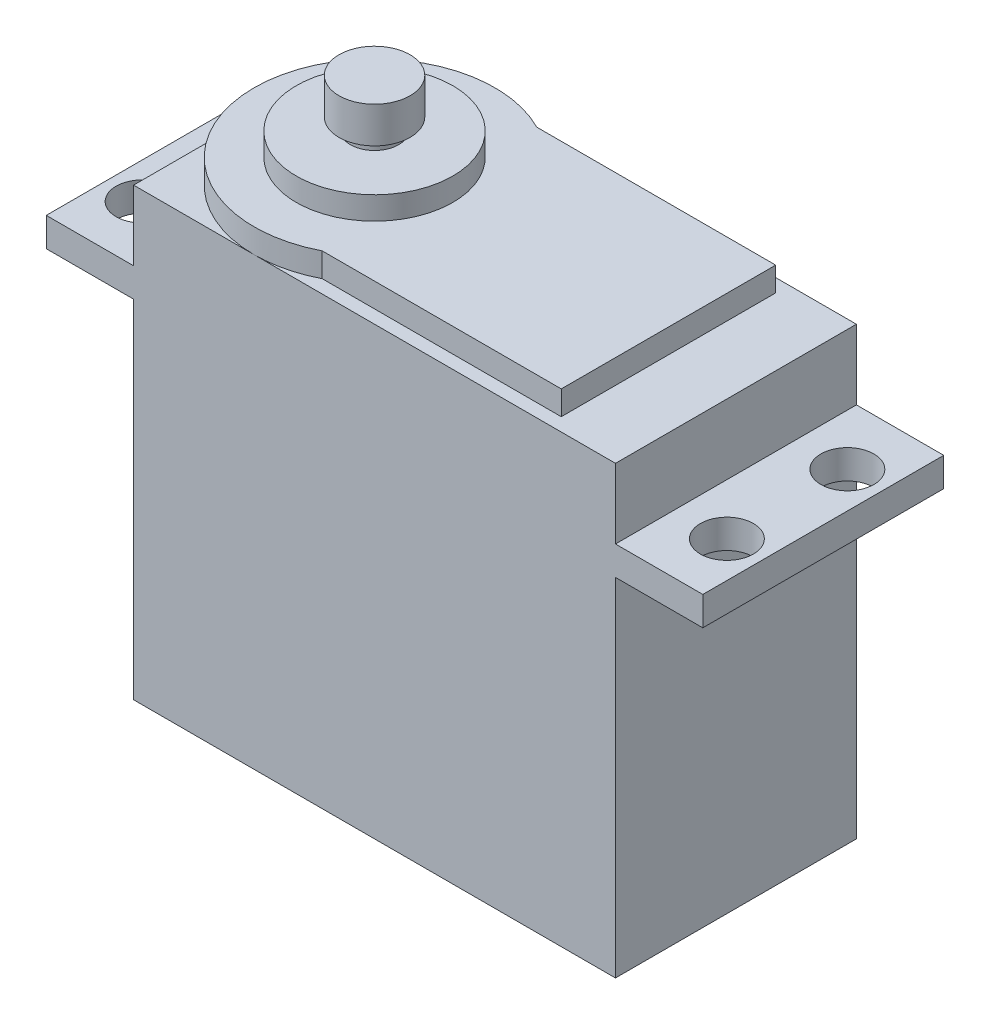
ISO-10303-21;
HEADER;
FILE_DESCRIPTION(('STEP AP214'),'2;1');
FILE_NAME('part.step','',(''),(''),'','','');
FILE_SCHEMA(('AUTOMOTIVE_DESIGN { 1 0 10303 214 1 1 1 1 }'));
ENDSEC;
DATA;
#1=APPLICATION_CONTEXT('core data for automotive mechanical design processes');
#2=APPLICATION_PROTOCOL_DEFINITION('international standard','automotive_design',2000,#1);
#3=PRODUCT_CONTEXT('',#1,'mechanical');
#4=PRODUCT('Part','Part','',(#3));
#5=PRODUCT_RELATED_PRODUCT_CATEGORY('part','',(#4));
#6=PRODUCT_DEFINITION_FORMATION('','',#4);
#7=PRODUCT_DEFINITION_CONTEXT('part definition',#1,'design');
#8=PRODUCT_DEFINITION('design','',#6,#7);
#9=PRODUCT_DEFINITION_SHAPE('','',#8);
#10=(LENGTH_UNIT() NAMED_UNIT(*) SI_UNIT(.MILLI.,.METRE.));
#11=(NAMED_UNIT(*) PLANE_ANGLE_UNIT() SI_UNIT($,.RADIAN.));
#12=(NAMED_UNIT(*) SI_UNIT($,.STERADIAN.) SOLID_ANGLE_UNIT());
#13=UNCERTAINTY_MEASURE_WITH_UNIT(LENGTH_MEASURE(1.E-05),#10,'distance_accuracy_value','');
#14=(GEOMETRIC_REPRESENTATION_CONTEXT(3) GLOBAL_UNCERTAINTY_ASSIGNED_CONTEXT((#13)) GLOBAL_UNIT_ASSIGNED_CONTEXT((#10,
#11,#12)) REPRESENTATION_CONTEXT('',''));
#15=CARTESIAN_POINT('',(0.,0.,0.));
#16=DIRECTION('',(0.,0.,1.));
#17=DIRECTION('',(1.,0.,0.));
#18=AXIS2_PLACEMENT_3D('',#15,#16,#17);
#19=CARTESIAN_POINT('',(-10.,44.9,0.));
#20=DIRECTION('',(0.,-1.,0.));
#21=DIRECTION('',(0.,0.,-1.));
#22=AXIS2_PLACEMENT_3D('',#19,#20,#21);
#23=CYLINDRICAL_SURFACE('',#22,2.);
#24=CARTESIAN_POINT('',(-10.,40.9,0.));
#25=DIRECTION('',(0.,1.,0.));
#26=DIRECTION('',(0.,0.,1.));
#27=AXIS2_PLACEMENT_3D('',#24,#25,#26);
#28=CIRCLE('',#27,2.);
#29=CARTESIAN_POINT('',(-10.,40.9,2.));
#30=VERTEX_POINT('',#29);
#31=EDGE_CURVE('E47',#30,#30,#28,.T.);
#32=ORIENTED_EDGE('',*,*,#31,.T.);
#33=EDGE_LOOP('',(#32));
#34=FACE_BOUND('',#33,.T.);
#35=CARTESIAN_POINT('',(-10.,41.9,0.));
#36=DIRECTION('',(0.,1.,0.));
#37=DIRECTION('',(0.,0.,1.));
#38=AXIS2_PLACEMENT_3D('',#35,#36,#37);
#39=CIRCLE('',#38,2.);
#40=CARTESIAN_POINT('',(-10.,41.9,2.));
#41=VERTEX_POINT('',#40);
#42=EDGE_CURVE('E11',#41,#41,#39,.T.);
#43=ORIENTED_EDGE('',*,*,#42,.F.);
#44=EDGE_LOOP('',(#43));
#45=FACE_BOUND('',#44,.T.);
#46=ADVANCED_FACE('F41',(#34,#45),#23,.T.);
#47=CARTESIAN_POINT('',(0.,37.,0.));
#48=DIRECTION('',(0.,1.,0.));
#49=DIRECTION('',(0.,0.,1.));
#50=AXIS2_PLACEMENT_3D('',#47,#48,#49);
#51=PLANE('',#50);
#52=CARTESIAN_POINT('',(-10.,37.,0.));
#53=DIRECTION('',(0.,1.,0.));
#54=DIRECTION('',(0.,0.,1.));
#55=AXIS2_PLACEMENT_3D('',#52,#53,#54);
#56=CIRCLE('',#55,10.);
#57=CARTESIAN_POINT('',(-5.4403947539288,37.,-8.9));
#58=VERTEX_POINT('',#57);
#59=CARTESIAN_POINT('',(-10.,37.,-10.));
#60=VERTEX_POINT('',#59);
#61=EDGE_CURVE('E57',#58,#60,#56,.T.);
#62=ORIENTED_EDGE('',*,*,#61,.F.);
#63=DIRECTION('',(-1.,0.,0.));
#64=VECTOR('',#63,1.);
#65=CARTESIAN_POINT('',(-5.4403947539288,37.,-8.9));
#66=LINE('',#65,#64);
#67=CARTESIAN_POINT('',(14.4,37.,-8.9));
#68=VERTEX_POINT('',#67);
#69=EDGE_CURVE('E58',#68,#58,#66,.T.);
#70=ORIENTED_EDGE('',*,*,#69,.F.);
#71=DIRECTION('',(0.,0.,-1.));
#72=VECTOR('',#71,1.);
#73=CARTESIAN_POINT('',(14.4,37.,-8.9));
#74=LINE('',#73,#72);
#75=CARTESIAN_POINT('',(14.4,37.,8.9));
#76=VERTEX_POINT('',#75);
#77=EDGE_CURVE('E439',#76,#68,#74,.T.);
#78=ORIENTED_EDGE('',*,*,#77,.F.);
#79=DIRECTION('',(1.,0.,0.));
#80=VECTOR('',#79,1.);
#81=CARTESIAN_POINT('',(14.4,37.,8.9));
#82=LINE('',#81,#80);
#83=CARTESIAN_POINT('',(-5.4403947539288,37.,8.9));
#84=VERTEX_POINT('',#83);
#85=EDGE_CURVE('E436',#84,#76,#82,.T.);
#86=ORIENTED_EDGE('',*,*,#85,.F.);
#87=CARTESIAN_POINT('',(-10.,37.,10.));
#88=VERTEX_POINT('',#87);
#89=EDGE_CURVE('E187',#88,#84,#56,.T.);
#90=ORIENTED_EDGE('',*,*,#89,.F.);
#91=DIRECTION('',(1.,0.,0.));
#92=VECTOR('',#91,1.);
#93=CARTESIAN_POINT('',(-20.,37.,10.));
#94=LINE('',#93,#92);
#95=CARTESIAN_POINT('',(20.,37.,10.));
#96=VERTEX_POINT('',#95);
#97=EDGE_CURVE('E274',#88,#96,#94,.T.);
#98=ORIENTED_EDGE('',*,*,#97,.T.);
#99=DIRECTION('',(0.,0.,-1.));
#100=VECTOR('',#99,1.);
#101=CARTESIAN_POINT('',(20.,37.,-10.));
#102=LINE('',#101,#100);
#103=CARTESIAN_POINT('',(20.,37.,-10.));
#104=VERTEX_POINT('',#103);
#105=EDGE_CURVE('E263',#96,#104,#102,.T.);
#106=ORIENTED_EDGE('',*,*,#105,.T.);
#107=DIRECTION('',(-1.,0.,0.));
#108=VECTOR('',#107,1.);
#109=CARTESIAN_POINT('',(-20.,37.,-10.));
#110=LINE('',#109,#108);
#111=EDGE_CURVE('E270',#104,#60,#110,.T.);
#112=ORIENTED_EDGE('',*,*,#111,.T.);
#113=EDGE_LOOP('',(#62,#70,#78,#86,#90,#98,#106,#112));
#114=FACE_BOUND('',#113,.T.);
#115=ADVANCED_FACE('F357',(#114),#51,.T.);
#116=CARTESIAN_POINT('',(-20.,37.,0.));
#117=VERTEX_POINT('',#116);
#118=EDGE_CURVE('E435',#60,#117,#56,.T.);
#119=ORIENTED_EDGE('',*,*,#118,.F.);
#120=CARTESIAN_POINT('',(-20.,37.,-10.));
#121=VERTEX_POINT('',#120);
#122=EDGE_CURVE('E267',#60,#121,#110,.T.);
#123=ORIENTED_EDGE('',*,*,#122,.T.);
#124=DIRECTION('',(0.,0.,1.));
#125=VECTOR('',#124,1.);
#126=CARTESIAN_POINT('',(-20.,37.,-10.));
#127=LINE('',#126,#125);
#128=EDGE_CURVE('E272',#121,#117,#127,.T.);
#129=ORIENTED_EDGE('',*,*,#128,.T.);
#130=EDGE_LOOP('',(#119,#123,#129));
#131=FACE_BOUND('',#130,.T.);
#132=ADVANCED_FACE('F362',(#131),#51,.T.);
#133=CARTESIAN_POINT('',(20.,37.,-10.));
#134=DIRECTION('',(-1.,0.,0.));
#135=DIRECTION('',(0.,0.,1.));
#136=AXIS2_PLACEMENT_3D('',#133,#134,#135);
#137=PLANE('',#136);
#138=DIRECTION('',(0.,0.,-1.));
#139=VECTOR('',#138,1.);
#140=CARTESIAN_POINT('',(20.,28.8,-10.));
#141=LINE('',#140,#139);
#142=CARTESIAN_POINT('',(20.,28.8,10.));
#143=VERTEX_POINT('',#142);
#144=CARTESIAN_POINT('',(20.,28.8,-10.));
#145=VERTEX_POINT('',#144);
#146=EDGE_CURVE('E259',#143,#145,#141,.T.);
#147=ORIENTED_EDGE('',*,*,#146,.F.);
#148=DIRECTION('',(0.,-1.,0.));
#149=VECTOR('',#148,1.);
#150=CARTESIAN_POINT('',(20.,37.,10.));
#151=LINE('',#150,#149);
#152=CARTESIAN_POINT('',(20.,0.,10.));
#153=VERTEX_POINT('',#152);
#154=EDGE_CURVE('E277',#143,#153,#151,.T.);
#155=ORIENTED_EDGE('',*,*,#154,.T.);
#156=DIRECTION('',(0.,0.,-1.));
#157=VECTOR('',#156,1.);
#158=CARTESIAN_POINT('',(20.,0.,-10.));
#159=LINE('',#158,#157);
#160=CARTESIAN_POINT('',(20.,0.,-10.));
#161=VERTEX_POINT('',#160);
#162=EDGE_CURVE('E265',#153,#161,#159,.T.);
#163=ORIENTED_EDGE('',*,*,#162,.T.);
#164=DIRECTION('',(0.,-1.,0.));
#165=VECTOR('',#164,1.);
#166=CARTESIAN_POINT('',(20.,37.,-10.));
#167=LINE('',#166,#165);
#168=EDGE_CURVE('E299',#145,#161,#167,.T.);
#169=ORIENTED_EDGE('',*,*,#168,.F.);
#170=EDGE_LOOP('',(#147,#155,#163,#169));
#171=FACE_BOUND('',#170,.T.);
#172=ADVANCED_FACE('F316',(#171),#137,.F.);
#173=CARTESIAN_POINT('',(-20.,37.,-10.));
#174=DIRECTION('',(1.,0.,0.));
#175=DIRECTION('',(0.,0.,-1.));
#176=AXIS2_PLACEMENT_3D('',#173,#174,#175);
#177=PLANE('',#176);
#178=DIRECTION('',(0.,0.,1.));
#179=VECTOR('',#178,1.);
#180=CARTESIAN_POINT('',(-20.,28.8,-10.));
#181=LINE('',#180,#179);
#182=CARTESIAN_POINT('',(-20.,28.8,-10.));
#183=VERTEX_POINT('',#182);
#184=CARTESIAN_POINT('',(-20.,28.8,10.));
#185=VERTEX_POINT('',#184);
#186=EDGE_CURVE('E257',#183,#185,#181,.T.);
#187=ORIENTED_EDGE('',*,*,#186,.F.);
#188=DIRECTION('',(0.,-1.,0.));
#189=VECTOR('',#188,1.);
#190=CARTESIAN_POINT('',(-20.,37.,-10.));
#191=LINE('',#190,#189);
#192=CARTESIAN_POINT('',(-20.,0.,-10.));
#193=VERTEX_POINT('',#192);
#194=EDGE_CURVE('E298',#183,#193,#191,.T.);
#195=ORIENTED_EDGE('',*,*,#194,.T.);
#196=DIRECTION('',(0.,0.,1.));
#197=VECTOR('',#196,1.);
#198=CARTESIAN_POINT('',(-20.,0.,-10.));
#199=LINE('',#198,#197);
#200=CARTESIAN_POINT('',(-20.,0.,10.));
#201=VERTEX_POINT('',#200);
#202=EDGE_CURVE('E282',#193,#201,#199,.T.);
#203=ORIENTED_EDGE('',*,*,#202,.T.);
#204=DIRECTION('',(0.,-1.,0.));
#205=VECTOR('',#204,1.);
#206=CARTESIAN_POINT('',(-20.,37.,10.));
#207=LINE('',#206,#205);
#208=EDGE_CURVE('E292',#185,#201,#207,.T.);
#209=ORIENTED_EDGE('',*,*,#208,.F.);
#210=EDGE_LOOP('',(#187,#195,#203,#209));
#211=FACE_BOUND('',#210,.T.);
#212=ADVANCED_FACE('F330',(#211),#177,.F.);
#213=CARTESIAN_POINT('',(20.,31.2,10.));
#214=VERTEX_POINT('',#213);
#215=EDGE_CURVE('E286',#96,#214,#151,.T.);
#216=ORIENTED_EDGE('',*,*,#215,.T.);
#217=DIRECTION('',(0.,0.,-1.));
#218=VECTOR('',#217,1.);
#219=CARTESIAN_POINT('',(20.,31.2,-10.));
#220=LINE('',#219,#218);
#221=CARTESIAN_POINT('',(20.,31.2,-10.));
#222=VERTEX_POINT('',#221);
#223=EDGE_CURVE('E253',#214,#222,#220,.T.);
#224=ORIENTED_EDGE('',*,*,#223,.T.);
#225=EDGE_CURVE('E297',#104,#222,#167,.T.);
#226=ORIENTED_EDGE('',*,*,#225,.F.);
#227=ORIENTED_EDGE('',*,*,#105,.F.);
#228=EDGE_LOOP('',(#216,#224,#226,#227));
#229=FACE_BOUND('',#228,.T.);
#230=ADVANCED_FACE('F43',(#229),#137,.F.);
#231=CARTESIAN_POINT('',(-20.,37.,-10.));
#232=DIRECTION('',(0.,0.,1.));
#233=DIRECTION('',(1.,0.,0.));
#234=AXIS2_PLACEMENT_3D('',#231,#232,#233);
#235=PLANE('',#234);
#236=ORIENTED_EDGE('',*,*,#225,.T.);
#237=DIRECTION('',(-1.,0.,0.));
#238=VECTOR('',#237,1.);
#239=CARTESIAN_POINT('',(-27.25,31.2,-10.));
#240=LINE('',#239,#238);
#241=CARTESIAN_POINT('',(27.25,31.2,-10.));
#242=VERTEX_POINT('',#241);
#243=EDGE_CURVE('E222',#242,#222,#240,.T.);
#244=ORIENTED_EDGE('',*,*,#243,.F.);
#245=DIRECTION('',(0.,1.,0.));
#246=VECTOR('',#245,1.);
#247=CARTESIAN_POINT('',(27.25,28.8,-10.));
#248=LINE('',#247,#246);
#249=CARTESIAN_POINT('',(27.25,28.8,-10.));
#250=VERTEX_POINT('',#249);
#251=EDGE_CURVE('E250',#250,#242,#248,.T.);
#252=ORIENTED_EDGE('',*,*,#251,.F.);
#253=DIRECTION('',(-1.,0.,0.));
#254=VECTOR('',#253,1.);
#255=CARTESIAN_POINT('',(-27.25,28.8,-10.));
#256=LINE('',#255,#254);
#257=EDGE_CURVE('E230',#250,#145,#256,.T.);
#258=ORIENTED_EDGE('',*,*,#257,.T.);
#259=ORIENTED_EDGE('',*,*,#168,.T.);
#260=DIRECTION('',(-1.,0.,0.));
#261=VECTOR('',#260,1.);
#262=CARTESIAN_POINT('',(-20.,0.,-10.));
#263=LINE('',#262,#261);
#264=EDGE_CURVE('E281',#161,#193,#263,.T.);
#265=ORIENTED_EDGE('',*,*,#264,.T.);
#266=ORIENTED_EDGE('',*,*,#194,.F.);
#267=CARTESIAN_POINT('',(-27.25,28.8,-10.));
#268=VERTEX_POINT('',#267);
#269=EDGE_CURVE('E226',#183,#268,#256,.T.);
#270=ORIENTED_EDGE('',*,*,#269,.T.);
#271=DIRECTION('',(0.,1.,0.));
#272=VECTOR('',#271,1.);
#273=CARTESIAN_POINT('',(-27.25,28.8,-10.));
#274=LINE('',#273,#272);
#275=CARTESIAN_POINT('',(-27.25,31.2,-10.));
#276=VERTEX_POINT('',#275);
#277=EDGE_CURVE('E243',#268,#276,#274,.T.);
#278=ORIENTED_EDGE('',*,*,#277,.T.);
#279=CARTESIAN_POINT('',(-20.,31.2,-10.));
#280=VERTEX_POINT('',#279);
#281=EDGE_CURVE('E241',#280,#276,#240,.T.);
#282=ORIENTED_EDGE('',*,*,#281,.F.);
#283=EDGE_CURVE('E300',#121,#280,#191,.T.);
#284=ORIENTED_EDGE('',*,*,#283,.F.);
#285=ORIENTED_EDGE('',*,*,#122,.F.);
#286=ORIENTED_EDGE('',*,*,#111,.F.);
#287=EDGE_LOOP('',(#236,#244,#252,#258,#259,#265,#266,#270,#278,#282,#284,#285,#286));
#288=FACE_BOUND('',#287,.T.);
#289=ADVANCED_FACE('F307',(#288),#235,.F.);
#290=ORIENTED_EDGE('',*,*,#283,.T.);
#291=DIRECTION('',(0.,0.,1.));
#292=VECTOR('',#291,1.);
#293=CARTESIAN_POINT('',(-20.,31.2,-10.));
#294=LINE('',#293,#292);
#295=CARTESIAN_POINT('',(-20.,31.2,10.));
#296=VERTEX_POINT('',#295);
#297=EDGE_CURVE('E246',#280,#296,#294,.T.);
#298=ORIENTED_EDGE('',*,*,#297,.T.);
#299=CARTESIAN_POINT('',(-20.,37.,10.));
#300=VERTEX_POINT('',#299);
#301=EDGE_CURVE('E291',#300,#296,#207,.T.);
#302=ORIENTED_EDGE('',*,*,#301,.F.);
#303=EDGE_CURVE('E268',#117,#300,#127,.T.);
#304=ORIENTED_EDGE('',*,*,#303,.F.);
#305=ORIENTED_EDGE('',*,*,#128,.F.);
#306=EDGE_LOOP('',(#290,#298,#302,#304,#305));
#307=FACE_BOUND('',#306,.T.);
#308=ADVANCED_FACE('F611',(#307),#177,.F.);
#309=CARTESIAN_POINT('',(-20.,37.,10.));
#310=DIRECTION('',(0.,0.,-1.));
#311=DIRECTION('',(-1.,0.,0.));
#312=AXIS2_PLACEMENT_3D('',#309,#310,#311);
#313=PLANE('',#312);
#314=ORIENTED_EDGE('',*,*,#301,.T.);
#315=DIRECTION('',(1.,0.,0.));
#316=VECTOR('',#315,1.);
#317=CARTESIAN_POINT('',(-27.25,31.2,10.));
#318=LINE('',#317,#316);
#319=CARTESIAN_POINT('',(-27.25,31.2,10.));
#320=VERTEX_POINT('',#319);
#321=EDGE_CURVE('E236',#320,#296,#318,.T.);
#322=ORIENTED_EDGE('',*,*,#321,.F.);
#323=DIRECTION('',(0.,1.,0.));
#324=VECTOR('',#323,1.);
#325=CARTESIAN_POINT('',(-27.25,28.8,10.));
#326=LINE('',#325,#324);
#327=CARTESIAN_POINT('',(-27.25,28.8,10.));
#328=VERTEX_POINT('',#327);
#329=EDGE_CURVE('E235',#328,#320,#326,.T.);
#330=ORIENTED_EDGE('',*,*,#329,.F.);
#331=DIRECTION('',(1.,0.,0.));
#332=VECTOR('',#331,1.);
#333=CARTESIAN_POINT('',(-27.25,28.8,10.));
#334=LINE('',#333,#332);
#335=EDGE_CURVE('E224',#328,#185,#334,.T.);
#336=ORIENTED_EDGE('',*,*,#335,.T.);
#337=ORIENTED_EDGE('',*,*,#208,.T.);
#338=DIRECTION('',(1.,0.,0.));
#339=VECTOR('',#338,1.);
#340=CARTESIAN_POINT('',(-20.,0.,10.));
#341=LINE('',#340,#339);
#342=EDGE_CURVE('E269',#201,#153,#341,.T.);
#343=ORIENTED_EDGE('',*,*,#342,.T.);
#344=ORIENTED_EDGE('',*,*,#154,.F.);
#345=CARTESIAN_POINT('',(27.25,28.8,10.));
#346=VERTEX_POINT('',#345);
#347=EDGE_CURVE('E219',#143,#346,#334,.T.);
#348=ORIENTED_EDGE('',*,*,#347,.T.);
#349=DIRECTION('',(0.,1.,0.));
#350=VECTOR('',#349,1.);
#351=CARTESIAN_POINT('',(27.25,28.8,10.));
#352=LINE('',#351,#350);
#353=CARTESIAN_POINT('',(27.25,31.2,10.));
#354=VERTEX_POINT('',#353);
#355=EDGE_CURVE('E248',#346,#354,#352,.T.);
#356=ORIENTED_EDGE('',*,*,#355,.T.);
#357=EDGE_CURVE('E232',#214,#354,#318,.T.);
#358=ORIENTED_EDGE('',*,*,#357,.F.);
#359=ORIENTED_EDGE('',*,*,#215,.F.);
#360=ORIENTED_EDGE('',*,*,#97,.F.);
#361=EDGE_CURVE('E273',#300,#88,#94,.T.);
#362=ORIENTED_EDGE('',*,*,#361,.F.);
#363=EDGE_LOOP('',(#314,#322,#330,#336,#337,#343,#344,#348,#356,#358,#359,#360,#362));
#364=FACE_BOUND('',#363,.T.);
#365=ADVANCED_FACE('F325',(#364),#313,.F.);
#366=EDGE_CURVE('E304',#117,#88,#56,.T.);
#367=ORIENTED_EDGE('',*,*,#366,.F.);
#368=ORIENTED_EDGE('',*,*,#303,.T.);
#369=ORIENTED_EDGE('',*,*,#361,.T.);
#370=EDGE_LOOP('',(#367,#368,#369));
#371=FACE_BOUND('',#370,.T.);
#372=ADVANCED_FACE('F370',(#371),#51,.T.);
#373=CARTESIAN_POINT('',(0.,0.,0.));
#374=DIRECTION('',(0.,1.,0.));
#375=DIRECTION('',(0.,0.,1.));
#376=AXIS2_PLACEMENT_3D('',#373,#374,#375);
#377=PLANE('',#376);
#378=ORIENTED_EDGE('',*,*,#162,.F.);
#379=ORIENTED_EDGE('',*,*,#342,.F.);
#380=ORIENTED_EDGE('',*,*,#202,.F.);
#381=ORIENTED_EDGE('',*,*,#264,.F.);
#382=EDGE_LOOP('',(#378,#379,#380,#381));
#383=FACE_BOUND('',#382,.T.);
#384=ADVANCED_FACE('F320',(#383),#377,.F.);
#385=CARTESIAN_POINT('',(-27.25,28.8,-10.));
#386=DIRECTION('',(-1.,0.,0.));
#387=DIRECTION('',(0.,0.,1.));
#388=AXIS2_PLACEMENT_3D('',#385,#386,#387);
#389=PLANE('',#388);
#390=DIRECTION('',(0.,0.,1.));
#391=VECTOR('',#390,1.);
#392=CARTESIAN_POINT('',(-27.25,31.2,-10.));
#393=LINE('',#392,#391);
#394=EDGE_CURVE('E213',#276,#320,#393,.T.);
#395=ORIENTED_EDGE('',*,*,#394,.F.);
#396=ORIENTED_EDGE('',*,*,#277,.F.);
#397=DIRECTION('',(0.,0.,1.));
#398=VECTOR('',#397,1.);
#399=CARTESIAN_POINT('',(-27.25,28.8,-10.));
#400=LINE('',#399,#398);
#401=EDGE_CURVE('E220',#268,#328,#400,.T.);
#402=ORIENTED_EDGE('',*,*,#401,.T.);
#403=ORIENTED_EDGE('',*,*,#329,.T.);
#404=EDGE_LOOP('',(#395,#396,#402,#403));
#405=FACE_BOUND('',#404,.T.);
#406=ADVANCED_FACE('F331',(#405),#389,.T.);
#407=CARTESIAN_POINT('',(-24.25,28.8,5.));
#408=DIRECTION('',(0.,1.,0.));
#409=DIRECTION('',(0.,0.,1.));
#410=AXIS2_PLACEMENT_3D('',#407,#408,#409);
#411=CYLINDRICAL_SURFACE('',#410,2.2);
#412=CARTESIAN_POINT('',(-24.25,28.8,5.));
#413=DIRECTION('',(0.,1.,0.));
#414=DIRECTION('',(0.,0.,1.));
#415=AXIS2_PLACEMENT_3D('',#412,#413,#414);
#416=CIRCLE('',#415,2.2);
#417=CARTESIAN_POINT('',(-24.25,28.8,7.2));
#418=VERTEX_POINT('',#417);
#419=EDGE_CURVE('E188',#418,#418,#416,.T.);
#420=ORIENTED_EDGE('',*,*,#419,.F.);
#421=EDGE_LOOP('',(#420));
#422=FACE_BOUND('',#421,.T.);
#423=CARTESIAN_POINT('',(-24.25,31.2,5.));
#424=DIRECTION('',(0.,1.,0.));
#425=DIRECTION('',(0.,0.,1.));
#426=AXIS2_PLACEMENT_3D('',#423,#424,#425);
#427=CIRCLE('',#426,2.2);
#428=CARTESIAN_POINT('',(-24.25,31.2,7.2));
#429=VERTEX_POINT('',#428);
#430=EDGE_CURVE('E190',#429,#429,#427,.T.);
#431=ORIENTED_EDGE('',*,*,#430,.T.);
#432=EDGE_LOOP('',(#431));
#433=FACE_BOUND('',#432,.T.);
#434=ADVANCED_FACE('F347',(#422,#433),#411,.F.);
#435=CARTESIAN_POINT('',(-24.25,28.8,-5.));
#436=DIRECTION('',(0.,1.,0.));
#437=DIRECTION('',(0.,0.,1.));
#438=AXIS2_PLACEMENT_3D('',#435,#436,#437);
#439=CYLINDRICAL_SURFACE('',#438,2.2);
#440=CARTESIAN_POINT('',(-24.25,28.8,-5.));
#441=DIRECTION('',(0.,1.,0.));
#442=DIRECTION('',(0.,0.,1.));
#443=AXIS2_PLACEMENT_3D('',#440,#441,#442);
#444=CIRCLE('',#443,2.2);
#445=CARTESIAN_POINT('',(-24.25,28.8,-2.8));
#446=VERTEX_POINT('',#445);
#447=EDGE_CURVE('E197',#446,#446,#444,.T.);
#448=ORIENTED_EDGE('',*,*,#447,.F.);
#449=EDGE_LOOP('',(#448));
#450=FACE_BOUND('',#449,.T.);
#451=CARTESIAN_POINT('',(-24.25,31.2,-5.));
#452=DIRECTION('',(0.,1.,0.));
#453=DIRECTION('',(0.,0.,1.));
#454=AXIS2_PLACEMENT_3D('',#451,#452,#453);
#455=CIRCLE('',#454,2.2);
#456=CARTESIAN_POINT('',(-24.25,31.2,-2.8));
#457=VERTEX_POINT('',#456);
#458=EDGE_CURVE('E200',#457,#457,#455,.T.);
#459=ORIENTED_EDGE('',*,*,#458,.T.);
#460=EDGE_LOOP('',(#459));
#461=FACE_BOUND('',#460,.T.);
#462=ADVANCED_FACE('F336',(#450,#461),#439,.F.);
#463=CARTESIAN_POINT('',(0.,28.8,0.));
#464=DIRECTION('',(0.,1.,0.));
#465=DIRECTION('',(0.,0.,1.));
#466=AXIS2_PLACEMENT_3D('',#463,#464,#465);
#467=PLANE('',#466);
#468=ORIENTED_EDGE('',*,*,#447,.T.);
#469=EDGE_LOOP('',(#468));
#470=FACE_BOUND('',#469,.T.);
#471=ORIENTED_EDGE('',*,*,#419,.T.);
#472=EDGE_LOOP('',(#471));
#473=FACE_BOUND('',#472,.T.);
#474=ORIENTED_EDGE('',*,*,#269,.F.);
#475=ORIENTED_EDGE('',*,*,#186,.T.);
#476=ORIENTED_EDGE('',*,*,#335,.F.);
#477=ORIENTED_EDGE('',*,*,#401,.F.);
#478=EDGE_LOOP('',(#474,#475,#476,#477));
#479=FACE_BOUND('',#478,.T.);
#480=ADVANCED_FACE('F333',(#470,#473,#479),#467,.F.);
#481=CARTESIAN_POINT('',(0.,31.2,0.));
#482=DIRECTION('',(0.,1.,0.));
#483=DIRECTION('',(0.,0.,1.));
#484=AXIS2_PLACEMENT_3D('',#481,#482,#483);
#485=PLANE('',#484);
#486=ORIENTED_EDGE('',*,*,#458,.F.);
#487=EDGE_LOOP('',(#486));
#488=FACE_BOUND('',#487,.T.);
#489=ORIENTED_EDGE('',*,*,#430,.F.);
#490=EDGE_LOOP('',(#489));
#491=FACE_BOUND('',#490,.T.);
#492=ORIENTED_EDGE('',*,*,#297,.F.);
#493=ORIENTED_EDGE('',*,*,#281,.T.);
#494=ORIENTED_EDGE('',*,*,#394,.T.);
#495=ORIENTED_EDGE('',*,*,#321,.T.);
#496=EDGE_LOOP('',(#492,#493,#494,#495));
#497=FACE_BOUND('',#496,.T.);
#498=ADVANCED_FACE('F340',(#488,#491,#497),#485,.T.);
#499=CARTESIAN_POINT('',(24.25,28.8,5.));
#500=DIRECTION('',(0.,1.,0.));
#501=DIRECTION('',(0.,0.,1.));
#502=AXIS2_PLACEMENT_3D('',#499,#500,#501);
#503=CIRCLE('',#502,2.2);
#504=CARTESIAN_POINT('',(24.25,28.8,7.2));
#505=VERTEX_POINT('',#504);
#506=EDGE_CURVE('E203',#505,#505,#503,.T.);
#507=ORIENTED_EDGE('',*,*,#506,.T.);
#508=EDGE_LOOP('',(#507));
#509=FACE_BOUND('',#508,.T.);
#510=CARTESIAN_POINT('',(24.25,28.8,-5.));
#511=DIRECTION('',(0.,1.,0.));
#512=DIRECTION('',(0.,0.,1.));
#513=AXIS2_PLACEMENT_3D('',#510,#511,#512);
#514=CIRCLE('',#513,2.2);
#515=CARTESIAN_POINT('',(24.25,28.8,-2.8));
#516=VERTEX_POINT('',#515);
#517=EDGE_CURVE('E211',#516,#516,#514,.T.);
#518=ORIENTED_EDGE('',*,*,#517,.T.);
#519=EDGE_LOOP('',(#518));
#520=FACE_BOUND('',#519,.T.);
#521=ORIENTED_EDGE('',*,*,#347,.F.);
#522=ORIENTED_EDGE('',*,*,#146,.T.);
#523=ORIENTED_EDGE('',*,*,#257,.F.);
#524=DIRECTION('',(0.,0.,-1.));
#525=VECTOR('',#524,1.);
#526=CARTESIAN_POINT('',(27.25,28.8,-10.));
#527=LINE('',#526,#525);
#528=EDGE_CURVE('E223',#346,#250,#527,.T.);
#529=ORIENTED_EDGE('',*,*,#528,.F.);
#530=EDGE_LOOP('',(#521,#522,#523,#529));
#531=FACE_BOUND('',#530,.T.);
#532=ADVANCED_FACE('F341',(#509,#520,#531),#467,.F.);
#533=CARTESIAN_POINT('',(24.25,31.2,-5.));
#534=DIRECTION('',(0.,1.,0.));
#535=DIRECTION('',(0.,0.,1.));
#536=AXIS2_PLACEMENT_3D('',#533,#534,#535);
#537=CIRCLE('',#536,2.2);
#538=CARTESIAN_POINT('',(24.25,31.2,-2.8));
#539=VERTEX_POINT('',#538);
#540=EDGE_CURVE('E206',#539,#539,#537,.T.);
#541=ORIENTED_EDGE('',*,*,#540,.F.);
#542=EDGE_LOOP('',(#541));
#543=FACE_BOUND('',#542,.T.);
#544=CARTESIAN_POINT('',(24.25,31.2,5.));
#545=DIRECTION('',(0.,1.,0.));
#546=DIRECTION('',(0.,0.,1.));
#547=AXIS2_PLACEMENT_3D('',#544,#545,#546);
#548=CIRCLE('',#547,2.2);
#549=CARTESIAN_POINT('',(24.25,31.2,7.2));
#550=VERTEX_POINT('',#549);
#551=EDGE_CURVE('E204',#550,#550,#548,.T.);
#552=ORIENTED_EDGE('',*,*,#551,.F.);
#553=EDGE_LOOP('',(#552));
#554=FACE_BOUND('',#553,.T.);
#555=ORIENTED_EDGE('',*,*,#223,.F.);
#556=ORIENTED_EDGE('',*,*,#357,.T.);
#557=DIRECTION('',(0.,0.,-1.));
#558=VECTOR('',#557,1.);
#559=CARTESIAN_POINT('',(27.25,31.2,-10.));
#560=LINE('',#559,#558);
#561=EDGE_CURVE('E238',#354,#242,#560,.T.);
#562=ORIENTED_EDGE('',*,*,#561,.T.);
#563=ORIENTED_EDGE('',*,*,#243,.T.);
#564=EDGE_LOOP('',(#555,#556,#562,#563));
#565=FACE_BOUND('',#564,.T.);
#566=ADVANCED_FACE('F348',(#543,#554,#565),#485,.T.);
#567=CARTESIAN_POINT('',(27.25,28.8,-10.));
#568=DIRECTION('',(1.,0.,0.));
#569=DIRECTION('',(0.,0.,-1.));
#570=AXIS2_PLACEMENT_3D('',#567,#568,#569);
#571=PLANE('',#570);
#572=ORIENTED_EDGE('',*,*,#561,.F.);
#573=ORIENTED_EDGE('',*,*,#355,.F.);
#574=ORIENTED_EDGE('',*,*,#528,.T.);
#575=ORIENTED_EDGE('',*,*,#251,.T.);
#576=EDGE_LOOP('',(#572,#573,#574,#575));
#577=FACE_BOUND('',#576,.T.);
#578=ADVANCED_FACE('F403',(#577),#571,.T.);
#579=CARTESIAN_POINT('',(24.25,28.8,-5.));
#580=DIRECTION('',(0.,1.,0.));
#581=DIRECTION('',(0.,0.,1.));
#582=AXIS2_PLACEMENT_3D('',#579,#580,#581);
#583=CYLINDRICAL_SURFACE('',#582,2.2);
#584=ORIENTED_EDGE('',*,*,#517,.F.);
#585=EDGE_LOOP('',(#584));
#586=FACE_BOUND('',#585,.T.);
#587=ORIENTED_EDGE('',*,*,#540,.T.);
#588=EDGE_LOOP('',(#587));
#589=FACE_BOUND('',#588,.T.);
#590=ADVANCED_FACE('F405',(#586,#589),#583,.F.);
#591=CARTESIAN_POINT('',(24.25,28.8,5.));
#592=DIRECTION('',(0.,1.,0.));
#593=DIRECTION('',(0.,0.,1.));
#594=AXIS2_PLACEMENT_3D('',#591,#592,#593);
#595=CYLINDRICAL_SURFACE('',#594,2.2);
#596=ORIENTED_EDGE('',*,*,#506,.F.);
#597=EDGE_LOOP('',(#596));
#598=FACE_BOUND('',#597,.T.);
#599=ORIENTED_EDGE('',*,*,#551,.T.);
#600=EDGE_LOOP('',(#599));
#601=FACE_BOUND('',#600,.T.);
#602=ADVANCED_FACE('F399',(#598,#601),#595,.F.);
#603=CARTESIAN_POINT('',(-10.,39.,0.));
#604=DIRECTION('',(0.,-1.,0.));
#605=DIRECTION('',(0.,0.,-1.));
#606=AXIS2_PLACEMENT_3D('',#603,#604,#605);
#607=CYLINDRICAL_SURFACE('',#606,10.);
#608=ORIENTED_EDGE('',*,*,#61,.T.);
#609=ORIENTED_EDGE('',*,*,#118,.T.);
#610=ORIENTED_EDGE('',*,*,#366,.T.);
#611=ORIENTED_EDGE('',*,*,#89,.T.);
#612=DIRECTION('',(0.,-1.,0.));
#613=VECTOR('',#612,1.);
#614=CARTESIAN_POINT('',(-5.4403947539288,39.,8.9));
#615=LINE('',#614,#613);
#616=CARTESIAN_POINT('',(-5.4403947539288,39.,8.9));
#617=VERTEX_POINT('',#616);
#618=EDGE_CURVE('E170',#617,#84,#615,.T.);
#619=ORIENTED_EDGE('',*,*,#618,.F.);
#620=CARTESIAN_POINT('',(-10.,39.,0.));
#621=DIRECTION('',(0.,1.,0.));
#622=DIRECTION('',(0.,0.,1.));
#623=AXIS2_PLACEMENT_3D('',#620,#621,#622);
#624=CIRCLE('',#623,10.);
#625=CARTESIAN_POINT('',(-5.4403947539288,39.,-8.9));
#626=VERTEX_POINT('',#625);
#627=EDGE_CURVE('E173',#626,#617,#624,.T.);
#628=ORIENTED_EDGE('',*,*,#627,.F.);
#629=DIRECTION('',(0.,-1.,0.));
#630=VECTOR('',#629,1.);
#631=CARTESIAN_POINT('',(-5.4403947539288,39.,-8.9));
#632=LINE('',#631,#630);
#633=EDGE_CURVE('E442',#626,#58,#632,.T.);
#634=ORIENTED_EDGE('',*,*,#633,.T.);
#635=EDGE_LOOP('',(#608,#609,#610,#611,#619,#628,#634));
#636=FACE_BOUND('',#635,.T.);
#637=ADVANCED_FACE('F183',(#636),#607,.T.);
#638=CARTESIAN_POINT('',(14.4,39.,8.9));
#639=DIRECTION('',(0.,0.,-1.));
#640=DIRECTION('',(-1.,0.,0.));
#641=AXIS2_PLACEMENT_3D('',#638,#639,#640);
#642=PLANE('',#641);
#643=ORIENTED_EDGE('',*,*,#85,.T.);
#644=DIRECTION('',(0.,-1.,0.));
#645=VECTOR('',#644,1.);
#646=CARTESIAN_POINT('',(14.4,39.,8.9));
#647=LINE('',#646,#645);
#648=CARTESIAN_POINT('',(14.4,39.,8.9));
#649=VERTEX_POINT('',#648);
#650=EDGE_CURVE('E169',#649,#76,#647,.T.);
#651=ORIENTED_EDGE('',*,*,#650,.F.);
#652=DIRECTION('',(1.,0.,0.));
#653=VECTOR('',#652,1.);
#654=CARTESIAN_POINT('',(14.4,39.,8.9));
#655=LINE('',#654,#653);
#656=EDGE_CURVE('E162',#617,#649,#655,.T.);
#657=ORIENTED_EDGE('',*,*,#656,.F.);
#658=ORIENTED_EDGE('',*,*,#618,.T.);
#659=EDGE_LOOP('',(#643,#651,#657,#658));
#660=FACE_BOUND('',#659,.T.);
#661=ADVANCED_FACE('F164',(#660),#642,.F.);
#662=CARTESIAN_POINT('',(14.4,39.,-8.9));
#663=DIRECTION('',(-1.,0.,0.));
#664=DIRECTION('',(0.,0.,1.));
#665=AXIS2_PLACEMENT_3D('',#662,#663,#664);
#666=PLANE('',#665);
#667=ORIENTED_EDGE('',*,*,#77,.T.);
#668=DIRECTION('',(0.,-1.,0.));
#669=VECTOR('',#668,1.);
#670=CARTESIAN_POINT('',(14.4,39.,-8.9));
#671=LINE('',#670,#669);
#672=CARTESIAN_POINT('',(14.4,39.,-8.9));
#673=VERTEX_POINT('',#672);
#674=EDGE_CURVE('E195',#673,#68,#671,.T.);
#675=ORIENTED_EDGE('',*,*,#674,.F.);
#676=DIRECTION('',(0.,0.,-1.));
#677=VECTOR('',#676,1.);
#678=CARTESIAN_POINT('',(14.4,39.,-8.9));
#679=LINE('',#678,#677);
#680=EDGE_CURVE('E175',#649,#673,#679,.T.);
#681=ORIENTED_EDGE('',*,*,#680,.F.);
#682=ORIENTED_EDGE('',*,*,#650,.T.);
#683=EDGE_LOOP('',(#667,#675,#681,#682));
#684=FACE_BOUND('',#683,.T.);
#685=ADVANCED_FACE('F387',(#684),#666,.F.);
#686=CARTESIAN_POINT('',(-5.4403947539288,39.,-8.9));
#687=DIRECTION('',(0.,0.,1.));
#688=DIRECTION('',(1.,0.,0.));
#689=AXIS2_PLACEMENT_3D('',#686,#687,#688);
#690=PLANE('',#689);
#691=ORIENTED_EDGE('',*,*,#69,.T.);
#692=ORIENTED_EDGE('',*,*,#633,.F.);
#693=DIRECTION('',(-1.,0.,0.));
#694=VECTOR('',#693,1.);
#695=CARTESIAN_POINT('',(-5.4403947539288,39.,-8.9));
#696=LINE('',#695,#694);
#697=EDGE_CURVE('E178',#673,#626,#696,.T.);
#698=ORIENTED_EDGE('',*,*,#697,.F.);
#699=ORIENTED_EDGE('',*,*,#674,.T.);
#700=EDGE_LOOP('',(#691,#692,#698,#699));
#701=FACE_BOUND('',#700,.T.);
#702=ADVANCED_FACE('F381',(#701),#690,.F.);
#703=CARTESIAN_POINT('',(-10.,39.,0.));
#704=DIRECTION('',(0.,1.,0.));
#705=DIRECTION('',(0.,0.,1.));
#706=AXIS2_PLACEMENT_3D('',#703,#704,#705);
#707=PLANE('',#706);
#708=CARTESIAN_POINT('',(-10.,39.,0.));
#709=DIRECTION('',(0.,1.,0.));
#710=DIRECTION('',(0.,0.,1.));
#711=AXIS2_PLACEMENT_3D('',#708,#709,#710);
#712=CIRCLE('',#711,6.5);
#713=CARTESIAN_POINT('',(-10.,39.,-6.5));
#714=VERTEX_POINT('',#713);
#715=EDGE_CURVE('E433',#714,#714,#712,.T.);
#716=ORIENTED_EDGE('',*,*,#715,.F.);
#717=EDGE_LOOP('',(#716));
#718=FACE_BOUND('',#717,.T.);
#719=ORIENTED_EDGE('',*,*,#627,.T.);
#720=ORIENTED_EDGE('',*,*,#656,.T.);
#721=ORIENTED_EDGE('',*,*,#680,.T.);
#722=ORIENTED_EDGE('',*,*,#697,.T.);
#723=EDGE_LOOP('',(#719,#720,#721,#722));
#724=FACE_BOUND('',#723,.T.);
#725=ADVANCED_FACE('F176',(#718,#724),#707,.T.);
#726=CARTESIAN_POINT('',(-10.,40.9,0.));
#727=DIRECTION('',(0.,-1.,0.));
#728=DIRECTION('',(0.,0.,-1.));
#729=AXIS2_PLACEMENT_3D('',#726,#727,#728);
#730=CYLINDRICAL_SURFACE('',#729,6.5);
#731=CARTESIAN_POINT('',(-10.,40.9,0.));
#732=DIRECTION('',(0.,1.,0.));
#733=DIRECTION('',(0.,0.,1.));
#734=AXIS2_PLACEMENT_3D('',#731,#732,#733);
#735=CIRCLE('',#734,6.5);
#736=CARTESIAN_POINT('',(-10.,40.9,-6.5));
#737=VERTEX_POINT('',#736);
#738=EDGE_CURVE('E440',#737,#737,#735,.T.);
#739=CARTESIAN_POINT('',(-10.,40.9,-6.5));
#740=CARTESIAN_POINT('',(-10.,40.8802083333333,-6.5));
#741=CARTESIAN_POINT('',(-10.,40.8604166666667,-6.5));
#742=CARTESIAN_POINT('',(-10.,40.8208333333333,-6.5));
#743=CARTESIAN_POINT('',(-10.,40.8010416666667,-6.5));
#744=CARTESIAN_POINT('',(-10.,40.7614583333333,-6.5));
#745=CARTESIAN_POINT('',(-10.,40.7416666666667,-6.5));
#746=CARTESIAN_POINT('',(-10.,40.7020833333333,-6.5));
#747=CARTESIAN_POINT('',(-10.,40.6822916666667,-6.5));
#748=CARTESIAN_POINT('',(-10.,40.6427083333333,-6.5));
#749=CARTESIAN_POINT('',(-10.,40.6229166666667,-6.5));
#750=CARTESIAN_POINT('',(-10.,40.5833333333333,-6.5));
#751=CARTESIAN_POINT('',(-10.,40.5635416666667,-6.5));
#752=CARTESIAN_POINT('',(-10.,40.5239583333333,-6.5));
#753=CARTESIAN_POINT('',(-10.,40.5041666666667,-6.5));
#754=CARTESIAN_POINT('',(-10.,40.4645833333333,-6.5));
#755=CARTESIAN_POINT('',(-10.,40.4447916666667,-6.5));
#756=CARTESIAN_POINT('',(-10.,40.4052083333333,-6.5));
#757=CARTESIAN_POINT('',(-10.,40.3854166666667,-6.5));
#758=CARTESIAN_POINT('',(-10.,40.3458333333333,-6.5));
#759=CARTESIAN_POINT('',(-10.,40.3260416666667,-6.5));
#760=CARTESIAN_POINT('',(-10.,40.2864583333333,-6.5));
#761=CARTESIAN_POINT('',(-10.,40.2666666666667,-6.5));
#762=CARTESIAN_POINT('',(-10.,40.2270833333333,-6.5));
#763=CARTESIAN_POINT('',(-10.,40.2072916666667,-6.5));
#764=CARTESIAN_POINT('',(-10.,40.1677083333333,-6.5));
#765=CARTESIAN_POINT('',(-10.,40.1479166666667,-6.5));
#766=CARTESIAN_POINT('',(-10.,40.1083333333333,-6.5));
#767=CARTESIAN_POINT('',(-10.,40.0885416666667,-6.5));
#768=CARTESIAN_POINT('',(-10.,40.0489583333333,-6.5));
#769=CARTESIAN_POINT('',(-10.,40.0291666666667,-6.5));
#770=CARTESIAN_POINT('',(-10.,39.9895833333333,-6.5));
#771=CARTESIAN_POINT('',(-10.,39.9697916666667,-6.5));
#772=CARTESIAN_POINT('',(-10.,39.9302083333333,-6.5));
#773=CARTESIAN_POINT('',(-10.,39.9104166666667,-6.5));
#774=CARTESIAN_POINT('',(-10.,39.8708333333333,-6.5));
#775=CARTESIAN_POINT('',(-10.,39.8510416666667,-6.5));
#776=CARTESIAN_POINT('',(-10.,39.8114583333333,-6.5));
#777=CARTESIAN_POINT('',(-10.,39.7916666666667,-6.5));
#778=CARTESIAN_POINT('',(-10.,39.7520833333333,-6.5));
#779=CARTESIAN_POINT('',(-10.,39.7322916666667,-6.5));
#780=CARTESIAN_POINT('',(-10.,39.6927083333333,-6.5));
#781=CARTESIAN_POINT('',(-10.,39.6729166666667,-6.5));
#782=CARTESIAN_POINT('',(-10.,39.6333333333333,-6.5));
#783=CARTESIAN_POINT('',(-10.,39.6135416666667,-6.5));
#784=CARTESIAN_POINT('',(-10.,39.5739583333333,-6.5));
#785=CARTESIAN_POINT('',(-10.,39.5541666666667,-6.5));
#786=CARTESIAN_POINT('',(-10.,39.5145833333333,-6.5));
#787=CARTESIAN_POINT('',(-10.,39.4947916666667,-6.5));
#788=CARTESIAN_POINT('',(-10.,39.4552083333333,-6.5));
#789=CARTESIAN_POINT('',(-10.,39.4354166666667,-6.5));
#790=CARTESIAN_POINT('',(-10.,39.3958333333333,-6.5));
#791=CARTESIAN_POINT('',(-10.,39.3760416666667,-6.5));
#792=CARTESIAN_POINT('',(-10.,39.3364583333333,-6.5));
#793=CARTESIAN_POINT('',(-10.,39.3166666666667,-6.5));
#794=CARTESIAN_POINT('',(-10.,39.2770833333333,-6.5));
#795=CARTESIAN_POINT('',(-10.,39.2572916666667,-6.5));
#796=CARTESIAN_POINT('',(-10.,39.2177083333333,-6.5));
#797=CARTESIAN_POINT('',(-10.,39.1979166666667,-6.5));
#798=CARTESIAN_POINT('',(-10.,39.1583333333333,-6.5));
#799=CARTESIAN_POINT('',(-10.,39.1385416666667,-6.5));
#800=CARTESIAN_POINT('',(-10.,39.0989583333333,-6.5));
#801=CARTESIAN_POINT('',(-10.,39.0791666666667,-6.5));
#802=CARTESIAN_POINT('',(-10.,39.0395833333333,-6.5));
#803=CARTESIAN_POINT('',(-10.,39.0197916666667,-6.5));
#804=CARTESIAN_POINT('',(-10.,39.,-6.5));
#805=B_SPLINE_CURVE_WITH_KNOTS('',3,(#739,#740,#741,#742,#743,#744,#745,#746,#747,#748,#749,
#750,#751,#752,#753,#754,#755,#756,#757,#758,#759,#760,#761,#762,#763,#764,#765,#766,#767,#768,
#769,#770,#771,#772,#773,#774,#775,#776,#777,#778,#779,#780,#781,#782,#783,#784,#785,#786,#787,
#788,#789,#790,#791,#792,#793,#794,#795,#796,#797,#798,#799,#800,#801,#802,#803,#804),
.UNSPECIFIED.,.F.,.F.,(4,2,2,2,2,2,2,2,2,2,2,2,2,2,2,2,2,2,2,2,2,2,2,2,2,2,2,2,2,2,2,2,4),(0.,
0.0593750000000004,0.118750000000001,0.178125000000001,0.237500000000002,0.296875000000002,
0.356250000000002,0.415625000000003,0.475000000000003,0.534375000000004,0.593750000000004,
0.653125000000004,0.712500000000005,0.771875000000005,0.831250000000006,0.890625000000006,0.95,
1.009375,1.06875,1.128125,1.1875,1.246875,1.30625,1.365625,1.425,1.484375,1.54375,1.603125,
1.6625,1.721875,1.78125000000001,1.84062500000001,1.9),.UNSPECIFIED.);
#806=EDGE_CURVE('BSEAM380',#737,#714,#805,.T.);
#807=ORIENTED_EDGE('',*,*,#738,.F.);
#808=ORIENTED_EDGE('',*,*,#715,.T.);
#809=ORIENTED_EDGE('',*,*,#806,.T.);
#810=ORIENTED_EDGE('',*,*,#806,.F.);
#811=EDGE_LOOP('',(#807,#809,#808,#810));
#812=FACE_BOUND('',#811,.T.);
#813=ADVANCED_FACE('F380',(#812),#730,.T.);
#814=CARTESIAN_POINT('',(-10.,40.9,0.));
#815=DIRECTION('',(0.,1.,0.));
#816=DIRECTION('',(0.,0.,1.));
#817=AXIS2_PLACEMENT_3D('',#814,#815,#816);
#818=PLANE('',#817);
#819=ORIENTED_EDGE('',*,*,#31,.F.);
#820=EDGE_LOOP('',(#819));
#821=FACE_BOUND('',#820,.T.);
#822=ORIENTED_EDGE('',*,*,#738,.T.);
#823=EDGE_LOOP('',(#822));
#824=FACE_BOUND('',#823,.T.);
#825=ADVANCED_FACE('F372',(#821,#824),#818,.T.);
#826=CARTESIAN_POINT('',(-10.,41.9,0.));
#827=DIRECTION('',(0.,1.,0.));
#828=DIRECTION('',(0.,0.,1.));
#829=AXIS2_PLACEMENT_3D('',#826,#827,#828);
#830=CYLINDRICAL_SURFACE('',#829,2.95);
#831=CARTESIAN_POINT('',(-10.,41.9,0.));
#832=DIRECTION('',(0.,1.,0.));
#833=DIRECTION('',(0.,0.,1.));
#834=AXIS2_PLACEMENT_3D('',#831,#832,#833);
#835=CIRCLE('',#834,2.95);
#836=CARTESIAN_POINT('',(-10.,41.9,2.95));
#837=VERTEX_POINT('',#836);
#838=EDGE_CURVE('E451',#837,#837,#835,.T.);
#839=ORIENTED_EDGE('',*,*,#838,.T.);
#840=EDGE_LOOP('',(#839));
#841=FACE_BOUND('',#840,.T.);
#842=CARTESIAN_POINT('',(-10.,44.9,0.));
#843=DIRECTION('',(0.,1.,0.));
#844=DIRECTION('',(0.,0.,1.));
#845=AXIS2_PLACEMENT_3D('',#842,#843,#844);
#846=CIRCLE('',#845,2.95);
#847=CARTESIAN_POINT('',(-10.,44.9,2.95));
#848=VERTEX_POINT('',#847);
#849=EDGE_CURVE('E452',#848,#848,#846,.T.);
#850=ORIENTED_EDGE('',*,*,#849,.F.);
#851=EDGE_LOOP('',(#850));
#852=FACE_BOUND('',#851,.T.);
#853=ADVANCED_FACE('F376',(#841,#852),#830,.T.);
#854=CARTESIAN_POINT('',(-10.,41.9,0.));
#855=DIRECTION('',(0.,1.,0.));
#856=DIRECTION('',(0.,0.,1.));
#857=AXIS2_PLACEMENT_3D('',#854,#855,#856);
#858=PLANE('',#857);
#859=ORIENTED_EDGE('',*,*,#42,.T.);
#860=EDGE_LOOP('',(#859));
#861=FACE_BOUND('',#860,.T.);
#862=ORIENTED_EDGE('',*,*,#838,.F.);
#863=EDGE_LOOP('',(#862));
#864=FACE_BOUND('',#863,.T.);
#865=ADVANCED_FACE('F462',(#861,#864),#858,.F.);
#866=CARTESIAN_POINT('',(-10.,44.9,0.));
#867=DIRECTION('',(0.,1.,0.));
#868=DIRECTION('',(0.,0.,1.));
#869=AXIS2_PLACEMENT_3D('',#866,#867,#868);
#870=PLANE('',#869);
#871=ORIENTED_EDGE('',*,*,#849,.T.);
#872=EDGE_LOOP('',(#871));
#873=FACE_BOUND('',#872,.T.);
#874=ADVANCED_FACE('F375',(#873),#870,.T.);
#875=CLOSED_SHELL('',(#46,#115,#132,#172,#212,#230,#289,#308,#365,#372,#384,#406,#434,#462,#480,
#498,#532,#566,#578,#590,#602,#637,#661,#685,#702,#725,#813,#825,#853,#865,#874));
#876=MANIFOLD_SOLID_BREP('B2',#875);
#877=ADVANCED_BREP_SHAPE_REPRESENTATION('',(#18,#876),#14);
#878=SHAPE_DEFINITION_REPRESENTATION(#9,#877);
ENDSEC;
END-ISO-10303-21;
